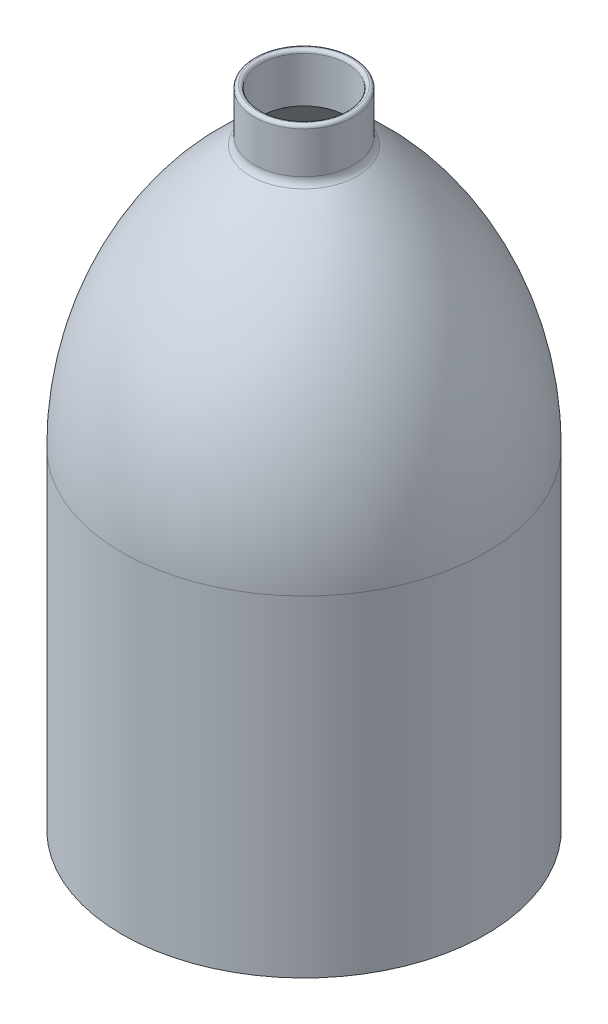
ISO-10303-21;
HEADER;
FILE_DESCRIPTION(('STEP AP214'),'2;1');
FILE_NAME('part.step','',(''),(''),'','','');
FILE_SCHEMA(('AUTOMOTIVE_DESIGN { 1 0 10303 214 1 1 1 1 }'));
ENDSEC;
DATA;
#1=APPLICATION_CONTEXT('core data for automotive mechanical design processes');
#2=APPLICATION_PROTOCOL_DEFINITION('international standard','automotive_design',2000,#1);
#3=PRODUCT_CONTEXT('',#1,'mechanical');
#4=PRODUCT('Part','Part','',(#3));
#5=PRODUCT_RELATED_PRODUCT_CATEGORY('part','',(#4));
#6=PRODUCT_DEFINITION_FORMATION('','',#4);
#7=PRODUCT_DEFINITION_CONTEXT('part definition',#1,'design');
#8=PRODUCT_DEFINITION('design','',#6,#7);
#9=PRODUCT_DEFINITION_SHAPE('','',#8);
#10=(LENGTH_UNIT() NAMED_UNIT(*) SI_UNIT(.MILLI.,.METRE.));
#11=(NAMED_UNIT(*) PLANE_ANGLE_UNIT() SI_UNIT($,.RADIAN.));
#12=(NAMED_UNIT(*) SI_UNIT($,.STERADIAN.) SOLID_ANGLE_UNIT());
#13=UNCERTAINTY_MEASURE_WITH_UNIT(LENGTH_MEASURE(1.E-05),#10,'distance_accuracy_value','');
#14=(GEOMETRIC_REPRESENTATION_CONTEXT(3) GLOBAL_UNCERTAINTY_ASSIGNED_CONTEXT((#13)) GLOBAL_UNIT_ASSIGNED_CONTEXT((#10,
#11,#12)) REPRESENTATION_CONTEXT('',''));
#15=CARTESIAN_POINT('',(0.,0.,0.));
#16=DIRECTION('',(0.,0.,1.));
#17=DIRECTION('',(1.,0.,0.));
#18=AXIS2_PLACEMENT_3D('',#15,#16,#17);
#19=CARTESIAN_POINT('',(0.,0.,0.));
#20=DIRECTION('',(0.,1.,0.));
#21=DIRECTION('',(0.,0.,1.));
#22=AXIS2_PLACEMENT_3D('',#19,#20,#21);
#23=PLANE('',#22);
#24=CARTESIAN_POINT('',(0.,0.,0.));
#25=DIRECTION('',(0.,1.,0.));
#26=DIRECTION('',(0.,0.,1.));
#27=AXIS2_PLACEMENT_3D('',#24,#25,#26);
#28=CIRCLE('',#27,55.);
#29=CARTESIAN_POINT('',(0.,0.,55.));
#30=VERTEX_POINT('',#29);
#31=EDGE_CURVE('E66',#30,#30,#28,.T.);
#32=ORIENTED_EDGE('',*,*,#31,.F.);
#33=EDGE_LOOP('',(#32));
#34=FACE_BOUND('',#33,.T.);
#35=CARTESIAN_POINT('',(0.,0.,0.));
#36=DIRECTION('',(0.,1.,0.));
#37=DIRECTION('',(0.,0.,1.));
#38=AXIS2_PLACEMENT_3D('',#35,#36,#37);
#39=CIRCLE('',#38,54.);
#40=CARTESIAN_POINT('',(0.,0.,54.));
#41=VERTEX_POINT('',#40);
#42=EDGE_CURVE('E70',#41,#41,#39,.T.);
#43=ORIENTED_EDGE('',*,*,#42,.T.);
#44=EDGE_LOOP('',(#43));
#45=FACE_BOUND('',#44,.T.);
#46=ADVANCED_FACE('F41',(#34,#45),#23,.F.);
#47=CARTESIAN_POINT('',(0.,100.,0.));
#48=DIRECTION('',(0.,-1.,0.));
#49=DIRECTION('',(0.,0.,-1.));
#50=AXIS2_PLACEMENT_3D('',#47,#48,#49);
#51=CYLINDRICAL_SURFACE('',#50,55.);
#52=CARTESIAN_POINT('',(0.,100.,0.));
#53=DIRECTION('',(0.,1.,0.));
#54=DIRECTION('',(0.,0.,1.));
#55=AXIS2_PLACEMENT_3D('',#52,#53,#54);
#56=CIRCLE('',#55,55.);
#57=CARTESIAN_POINT('',(0.,100.,55.));
#58=VERTEX_POINT('',#57);
#59=EDGE_CURVE('E65',#58,#58,#56,.T.);
#60=ORIENTED_EDGE('',*,*,#59,.F.);
#61=EDGE_LOOP('',(#60));
#62=FACE_BOUND('',#61,.T.);
#63=ORIENTED_EDGE('',*,*,#31,.T.);
#64=EDGE_LOOP('',(#63));
#65=FACE_BOUND('',#64,.T.);
#66=ADVANCED_FACE('F104',(#62,#65),#51,.T.);
#67=CARTESIAN_POINT('',(0.,100.,0.));
#68=DIRECTION('',(0.,-1.,0.));
#69=DIRECTION('',(0.,0.,-1.));
#70=AXIS2_PLACEMENT_3D('',#67,#68,#69);
#71=CYLINDRICAL_SURFACE('',#70,54.);
#72=CARTESIAN_POINT('',(0.,100.,0.));
#73=DIRECTION('',(0.,-1.,0.));
#74=DIRECTION('',(0.,0.,-1.));
#75=AXIS2_PLACEMENT_3D('',#72,#73,#74);
#76=CIRCLE('',#75,54.);
#77=CARTESIAN_POINT('',(0.,100.,-54.));
#78=VERTEX_POINT('',#77);
#79=EDGE_CURVE('E77',#78,#78,#76,.T.);
#80=ORIENTED_EDGE('',*,*,#79,.F.);
#81=EDGE_LOOP('',(#80));
#82=FACE_BOUND('',#81,.T.);
#83=ORIENTED_EDGE('',*,*,#42,.F.);
#84=EDGE_LOOP('',(#83));
#85=FACE_BOUND('',#84,.T.);
#86=ADVANCED_FACE('F110',(#82,#85),#71,.F.);
#87=CARTESIAN_POINT('',(0.,0.,0.));
#88=DIRECTION('',(0.,-1.,0.));
#89=DIRECTION('',(0.,0.,-1.));
#90=AXIS2_PLACEMENT_3D('',#87,#88,#89);
#91=CYLINDRICAL_SURFACE('',#90,15.);
#92=CARTESIAN_POINT('',(0.,194.,0.));
#93=DIRECTION('',(0.,-1.,0.));
#94=DIRECTION('',(0.,0.,-1.));
#95=AXIS2_PLACEMENT_3D('',#92,#93,#94);
#96=CIRCLE('',#95,15.);
#97=CARTESIAN_POINT('',(0.,194.,-15.));
#98=VERTEX_POINT('',#97);
#99=EDGE_CURVE('E10',#98,#98,#96,.T.);
#100=ORIENTED_EDGE('',*,*,#99,.T.);
#101=EDGE_LOOP('',(#100));
#102=FACE_BOUND('',#101,.T.);
#103=CARTESIAN_POINT('',(0.,181.486195149853,0.));
#104=DIRECTION('',(0.,-1.,0.));
#105=DIRECTION('',(0.,0.,-1.));
#106=AXIS2_PLACEMENT_3D('',#103,#104,#105);
#107=CIRCLE('',#106,15.);
#108=CARTESIAN_POINT('',(0.,181.486195149853,-15.));
#109=VERTEX_POINT('',#108);
#110=EDGE_CURVE('E55',#109,#109,#107,.F.);
#111=ORIENTED_EDGE('',*,*,#110,.T.);
#112=EDGE_LOOP('',(#111));
#113=FACE_BOUND('',#112,.T.);
#114=ADVANCED_FACE('F118',(#102,#113),#91,.T.);
#115=CARTESIAN_POINT('',(0.,100.,0.));
#116=DIRECTION('',(0.,-1.,0.));
#117=DIRECTION('',(0.,0.,-1.));
#118=AXIS2_PLACEMENT_3D('',#115,#116,#117);
#119=DEGENERATE_TOROIDAL_SURFACE('',#118,45.,99.9999999999999,.F.);
#120=CARTESIAN_POINT('',(0.,179.1128108251,0.));
#121=DIRECTION('',(0.,-1.,0.));
#122=DIRECTION('',(0.,0.,-1.));
#123=AXIS2_PLACEMENT_3D('',#120,#121,#122);
#124=CIRCLE('',#123,16.1650485436893);
#125=CARTESIAN_POINT('',(0.,179.1128108251,-16.1650485436893));
#126=VERTEX_POINT('',#125);
#127=EDGE_CURVE('E61',#126,#126,#124,.T.);
#128=ORIENTED_EDGE('',*,*,#127,.T.);
#129=EDGE_LOOP('',(#128));
#130=FACE_BOUND('',#129,.T.);
#131=ORIENTED_EDGE('',*,*,#59,.T.);
#132=EDGE_LOOP('',(#131));
#133=FACE_BOUND('',#132,.T.);
#134=ADVANCED_FACE('F122',(#130,#133),#119,.F.);
#135=CARTESIAN_POINT('',(0.,100.,0.));
#136=DIRECTION('',(0.,-1.,0.));
#137=DIRECTION('',(0.,0.,-1.));
#138=AXIS2_PLACEMENT_3D('',#135,#136,#137);
#139=DEGENERATE_TOROIDAL_SURFACE('',#138,45.,98.9999999999999,.F.);
#140=ORIENTED_EDGE('',*,*,#79,.T.);
#141=EDGE_LOOP('',(#140));
#142=FACE_BOUND('',#141,.T.);
#143=CARTESIAN_POINT('',(0.,180.230916734137,0.));
#144=DIRECTION('',(0.,-1.,0.));
#145=DIRECTION('',(0.,0.,-1.));
#146=AXIS2_PLACEMENT_3D('',#143,#144,#145);
#147=CIRCLE('',#146,13.);
#148=CARTESIAN_POINT('',(0.,180.230916734137,-13.));
#149=VERTEX_POINT('',#148);
#150=EDGE_CURVE('E81',#149,#149,#147,.T.);
#151=ORIENTED_EDGE('',*,*,#150,.F.);
#152=EDGE_LOOP('',(#151));
#153=FACE_BOUND('',#152,.T.);
#154=ADVANCED_FACE('F125',(#142,#153),#139,.T.);
#155=CARTESIAN_POINT('',(0.,-0.001000000000001,0.));
#156=DIRECTION('',(0.,1.,0.));
#157=DIRECTION('',(0.,0.,1.));
#158=AXIS2_PLACEMENT_3D('',#155,#156,#157);
#159=CYLINDRICAL_SURFACE('',#158,13.);
#160=CARTESIAN_POINT('',(0.,194.,0.));
#161=DIRECTION('',(0.,-1.,0.));
#162=DIRECTION('',(0.,0.,-1.));
#163=AXIS2_PLACEMENT_3D('',#160,#161,#162);
#164=CIRCLE('',#163,13.);
#165=CARTESIAN_POINT('',(0.,194.,-13.));
#166=VERTEX_POINT('',#165);
#167=EDGE_CURVE('E50',#166,#166,#164,.F.);
#168=ORIENTED_EDGE('',*,*,#167,.T.);
#169=EDGE_LOOP('',(#168));
#170=FACE_BOUND('',#169,.T.);
#171=ORIENTED_EDGE('',*,*,#150,.T.);
#172=EDGE_LOOP('',(#171));
#173=FACE_BOUND('',#172,.T.);
#174=ADVANCED_FACE('F100',(#170,#173),#159,.F.);
#175=CARTESIAN_POINT('',(0.,181.486195149853,0.));
#176=DIRECTION('',(0.,-1.,0.));
#177=DIRECTION('',(0.,0.,-1.));
#178=AXIS2_PLACEMENT_3D('',#175,#176,#177);
#179=TOROIDAL_SURFACE('',#178,18.,3.);
#180=ORIENTED_EDGE('',*,*,#110,.F.);
#181=EDGE_LOOP('',(#180));
#182=FACE_BOUND('',#181,.T.);
#183=ORIENTED_EDGE('',*,*,#127,.F.);
#184=EDGE_LOOP('',(#183));
#185=FACE_BOUND('',#184,.T.);
#186=ADVANCED_FACE('F94',(#182,#185),#179,.F.);
#187=CARTESIAN_POINT('',(0.,194.,0.));
#188=DIRECTION('',(0.,-1.,0.));
#189=DIRECTION('',(0.,0.,-1.));
#190=AXIS2_PLACEMENT_3D('',#187,#188,#189);
#191=TOROIDAL_SURFACE('',#190,14.,1.);
#192=ORIENTED_EDGE('',*,*,#99,.F.);
#193=EDGE_LOOP('',(#192));
#194=FACE_BOUND('',#193,.T.);
#195=CARTESIAN_POINT('',(0.,195.,0.));
#196=DIRECTION('',(0.,-1.,0.));
#197=DIRECTION('',(0.,0.,-1.));
#198=AXIS2_PLACEMENT_3D('',#195,#196,#197);
#199=CIRCLE('',#198,14.);
#200=CARTESIAN_POINT('',(0.,195.,-14.));
#201=VERTEX_POINT('',#200);
#202=EDGE_CURVE('E45',#201,#201,#199,.F.);
#203=ORIENTED_EDGE('',*,*,#202,.F.);
#204=EDGE_LOOP('',(#203));
#205=FACE_BOUND('',#204,.T.);
#206=ADVANCED_FACE('F43',(#194,#205),#191,.T.);
#207=CARTESIAN_POINT('',(0.,194.,0.));
#208=DIRECTION('',(0.,-1.,0.));
#209=DIRECTION('',(0.,0.,-1.));
#210=AXIS2_PLACEMENT_3D('',#207,#208,#209);
#211=TOROIDAL_SURFACE('',#210,14.,1.);
#212=ORIENTED_EDGE('',*,*,#202,.T.);
#213=EDGE_LOOP('',(#212));
#214=FACE_BOUND('',#213,.T.);
#215=ORIENTED_EDGE('',*,*,#167,.F.);
#216=EDGE_LOOP('',(#215));
#217=FACE_BOUND('',#216,.T.);
#218=ADVANCED_FACE('F90',(#214,#217),#211,.T.);
#219=CLOSED_SHELL('',(#46,#66,#86,#114,#134,#154,#174,#186,#206,#218));
#220=MANIFOLD_SOLID_BREP('B2',#219);
#221=ADVANCED_BREP_SHAPE_REPRESENTATION('',(#18,#220),#14);
#222=SHAPE_DEFINITION_REPRESENTATION(#9,#221);
ENDSEC;
END-ISO-10303-21;
